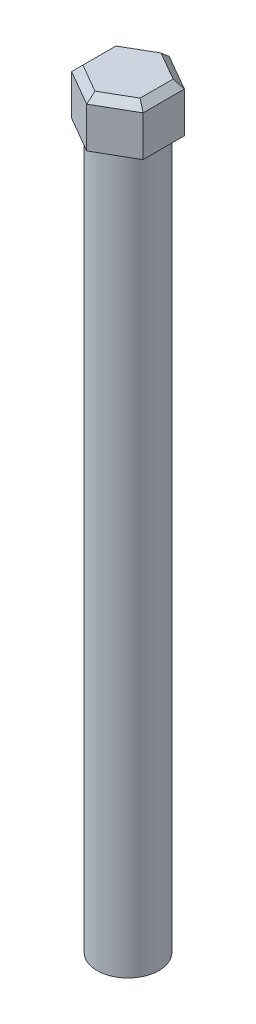
ISO-10303-21;
HEADER;
FILE_DESCRIPTION(('STEP AP214'),'2;1');
FILE_NAME('part.step','',(''),(''),'','','');
FILE_SCHEMA(('AUTOMOTIVE_DESIGN { 1 0 10303 214 1 1 1 1 }'));
ENDSEC;
DATA;
#1=APPLICATION_CONTEXT('core data for automotive mechanical design processes');
#2=APPLICATION_PROTOCOL_DEFINITION('international standard','automotive_design',2000,#1);
#3=PRODUCT_CONTEXT('',#1,'mechanical');
#4=PRODUCT('Part','Part','',(#3));
#5=PRODUCT_RELATED_PRODUCT_CATEGORY('part','',(#4));
#6=PRODUCT_DEFINITION_FORMATION('','',#4);
#7=PRODUCT_DEFINITION_CONTEXT('part definition',#1,'design');
#8=PRODUCT_DEFINITION('design','',#6,#7);
#9=PRODUCT_DEFINITION_SHAPE('','',#8);
#10=(LENGTH_UNIT() NAMED_UNIT(*) SI_UNIT(.MILLI.,.METRE.));
#11=(NAMED_UNIT(*) PLANE_ANGLE_UNIT() SI_UNIT($,.RADIAN.));
#12=(NAMED_UNIT(*) SI_UNIT($,.STERADIAN.) SOLID_ANGLE_UNIT());
#13=UNCERTAINTY_MEASURE_WITH_UNIT(LENGTH_MEASURE(1.E-05),#10,'distance_accuracy_value','');
#14=(GEOMETRIC_REPRESENTATION_CONTEXT(3) GLOBAL_UNCERTAINTY_ASSIGNED_CONTEXT((#13)) GLOBAL_UNIT_ASSIGNED_CONTEXT((#10,
#11,#12)) REPRESENTATION_CONTEXT('',''));
#15=CARTESIAN_POINT('',(0.,0.,0.));
#16=DIRECTION('',(0.,0.,1.));
#17=DIRECTION('',(1.,0.,0.));
#18=AXIS2_PLACEMENT_3D('',#15,#16,#17);
#19=CARTESIAN_POINT('',(0.129999999999999,0.,0.));
#20=DIRECTION('',(0.,-1.,0.));
#21=DIRECTION('',(1.,0.,0.));
#22=AXIS2_PLACEMENT_3D('',#19,#20,#21);
#23=PLANE('',#22);
#24=CARTESIAN_POINT('',(0.,0.,0.));
#25=DIRECTION('',(0.,-1.,0.));
#26=DIRECTION('',(1.,0.,0.));
#27=AXIS2_PLACEMENT_3D('',#24,#25,#26);
#28=CIRCLE('',#27,0.129999999999999);
#29=CARTESIAN_POINT('',(0.129999999999999,0.,0.));
#30=VERTEX_POINT('',#29);
#31=EDGE_CURVE('E175',#30,#30,#28,.T.);
#32=ORIENTED_EDGE('',*,*,#31,.T.);
#33=EDGE_LOOP('',(#32));
#34=FACE_BOUND('',#33,.T.);
#35=ADVANCED_FACE('F41',(#34),#23,.T.);
#36=CARTESIAN_POINT('',(0.,0.,0.));
#37=DIRECTION('',(0.,-1.,0.));
#38=DIRECTION('',(1.,0.,0.));
#39=AXIS2_PLACEMENT_3D('',#36,#37,#38);
#40=CYLINDRICAL_SURFACE('',#39,0.129999999999999);
#41=CARTESIAN_POINT('',(0.,3.,0.));
#42=DIRECTION('',(0.,-1.,0.));
#43=DIRECTION('',(1.,0.,0.));
#44=AXIS2_PLACEMENT_3D('',#41,#42,#43);
#45=CIRCLE('',#44,0.129999999999999);
#46=CARTESIAN_POINT('',(0.129999999999999,3.,0.));
#47=VERTEX_POINT('',#46);
#48=EDGE_CURVE('E126',#47,#47,#45,.T.);
#49=ORIENTED_EDGE('',*,*,#48,.T.);
#50=EDGE_LOOP('',(#49));
#51=FACE_BOUND('',#50,.T.);
#52=ORIENTED_EDGE('',*,*,#31,.F.);
#53=EDGE_LOOP('',(#52));
#54=FACE_BOUND('',#53,.T.);
#55=ADVANCED_FACE('F267',(#51,#54),#40,.T.);
#56=CARTESIAN_POINT('',(0.15,3.2,-0.0866025403784439));
#57=DIRECTION('',(-0.5,0.,0.866025403784438));
#58=DIRECTION('',(0.866025403784439,0.,0.5));
#59=AXIS2_PLACEMENT_3D('',#56,#57,#58);
#60=PLANE('',#59);
#61=DIRECTION('',(0.,-1.,0.));
#62=VECTOR('',#61,1.);
#63=CARTESIAN_POINT('',(0.,3.2,-0.173205080756888));
#64=LINE('',#63,#62);
#65=CARTESIAN_POINT('',(0.,3.17,-0.173205080756888));
#66=VERTEX_POINT('',#65);
#67=CARTESIAN_POINT('',(0.,3.,-0.173205080756888));
#68=VERTEX_POINT('',#67);
#69=EDGE_CURVE('E114',#66,#68,#64,.T.);
#70=ORIENTED_EDGE('',*,*,#69,.F.);
#71=DIRECTION('',(0.866025403784439,0.,0.5));
#72=VECTOR('',#71,1.);
#73=CARTESIAN_POINT('',(0.15,3.17,-0.0866025403784439));
#74=LINE('',#73,#72);
#75=CARTESIAN_POINT('',(0.15,3.17,-0.0866025403784439));
#76=VERTEX_POINT('',#75);
#77=EDGE_CURVE('E205',#66,#76,#74,.T.);
#78=ORIENTED_EDGE('',*,*,#77,.T.);
#79=DIRECTION('',(0.,-1.,0.));
#80=VECTOR('',#79,1.);
#81=CARTESIAN_POINT('',(0.15,3.2,-0.0866025403784439));
#82=LINE('',#81,#80);
#83=CARTESIAN_POINT('',(0.15,3.,-0.0866025403784439));
#84=VERTEX_POINT('',#83);
#85=EDGE_CURVE('E141',#76,#84,#82,.T.);
#86=ORIENTED_EDGE('',*,*,#85,.T.);
#87=DIRECTION('',(-0.866025403784438,0.,-0.5));
#88=VECTOR('',#87,1.);
#89=CARTESIAN_POINT('',(0.15,3.,-0.0866025403784439));
#90=LINE('',#89,#88);
#91=EDGE_CURVE('E133',#84,#68,#90,.T.);
#92=ORIENTED_EDGE('',*,*,#91,.T.);
#93=EDGE_LOOP('',(#70,#78,#86,#92));
#94=FACE_BOUND('',#93,.T.);
#95=ADVANCED_FACE('F139',(#94),#60,.F.);
#96=CARTESIAN_POINT('',(0.,3.2,-0.173205080756888));
#97=DIRECTION('',(0.5,0.,0.866025403784439));
#98=DIRECTION('',(0.866025403784439,0.,-0.5));
#99=AXIS2_PLACEMENT_3D('',#96,#97,#98);
#100=PLANE('',#99);
#101=DIRECTION('',(0.,-1.,0.));
#102=VECTOR('',#101,1.);
#103=CARTESIAN_POINT('',(-0.15,3.2,-0.0866025403784439));
#104=LINE('',#103,#102);
#105=CARTESIAN_POINT('',(-0.15,3.17,-0.0866025403784439));
#106=VERTEX_POINT('',#105);
#107=CARTESIAN_POINT('',(-0.15,3.,-0.0866025403784439));
#108=VERTEX_POINT('',#107);
#109=EDGE_CURVE('E127',#106,#108,#104,.T.);
#110=ORIENTED_EDGE('',*,*,#109,.F.);
#111=DIRECTION('',(0.866025403784439,0.,-0.5));
#112=VECTOR('',#111,1.);
#113=CARTESIAN_POINT('',(0.,3.17,-0.173205080756888));
#114=LINE('',#113,#112);
#115=EDGE_CURVE('E121',#106,#66,#114,.T.);
#116=ORIENTED_EDGE('',*,*,#115,.T.);
#117=ORIENTED_EDGE('',*,*,#69,.T.);
#118=DIRECTION('',(-0.866025403784439,0.,0.5));
#119=VECTOR('',#118,1.);
#120=CARTESIAN_POINT('',(0.,3.,-0.173205080756888));
#121=LINE('',#120,#119);
#122=EDGE_CURVE('E118',#68,#108,#121,.T.);
#123=ORIENTED_EDGE('',*,*,#122,.T.);
#124=EDGE_LOOP('',(#110,#116,#117,#123));
#125=FACE_BOUND('',#124,.T.);
#126=ADVANCED_FACE('F117',(#125),#100,.F.);
#127=CARTESIAN_POINT('',(-0.15,3.2,-0.0866025403784439));
#128=DIRECTION('',(1.,0.,0.));
#129=DIRECTION('',(0.,1.,0.));
#130=AXIS2_PLACEMENT_3D('',#127,#128,#129);
#131=PLANE('',#130);
#132=DIRECTION('',(0.,-1.,0.));
#133=VECTOR('',#132,1.);
#134=CARTESIAN_POINT('',(-0.15,3.2,0.0866025403784439));
#135=LINE('',#134,#133);
#136=CARTESIAN_POINT('',(-0.15,3.17,0.0866025403784439));
#137=VERTEX_POINT('',#136);
#138=CARTESIAN_POINT('',(-0.15,3.,0.0866025403784439));
#139=VERTEX_POINT('',#138);
#140=EDGE_CURVE('E170',#137,#139,#135,.T.);
#141=ORIENTED_EDGE('',*,*,#140,.F.);
#142=DIRECTION('',(0.,0.,-1.));
#143=VECTOR('',#142,1.);
#144=CARTESIAN_POINT('',(-0.15,3.17,-0.0866025403784439));
#145=LINE('',#144,#143);
#146=EDGE_CURVE('E210',#137,#106,#145,.T.);
#147=ORIENTED_EDGE('',*,*,#146,.T.);
#148=ORIENTED_EDGE('',*,*,#109,.T.);
#149=DIRECTION('',(0.,0.,1.));
#150=VECTOR('',#149,1.);
#151=CARTESIAN_POINT('',(-0.15,3.,-0.0866025403784439));
#152=LINE('',#151,#150);
#153=EDGE_CURVE('E136',#108,#139,#152,.T.);
#154=ORIENTED_EDGE('',*,*,#153,.T.);
#155=EDGE_LOOP('',(#141,#147,#148,#154));
#156=FACE_BOUND('',#155,.T.);
#157=ADVANCED_FACE('F370',(#156),#131,.F.);
#158=CARTESIAN_POINT('',(-0.15,3.2,0.0866025403784439));
#159=DIRECTION('',(0.5,0.,-0.866025403784439));
#160=DIRECTION('',(-0.866025403784439,0.,-0.5));
#161=AXIS2_PLACEMENT_3D('',#158,#159,#160);
#162=PLANE('',#161);
#163=DIRECTION('',(0.,-1.,0.));
#164=VECTOR('',#163,1.);
#165=CARTESIAN_POINT('',(0.,3.2,0.173205080756888));
#166=LINE('',#165,#164);
#167=CARTESIAN_POINT('',(0.,3.17,0.173205080756888));
#168=VERTEX_POINT('',#167);
#169=CARTESIAN_POINT('',(0.,3.,0.173205080756888));
#170=VERTEX_POINT('',#169);
#171=EDGE_CURVE('E167',#168,#170,#166,.T.);
#172=ORIENTED_EDGE('',*,*,#171,.F.);
#173=DIRECTION('',(-0.866025403784439,0.,-0.5));
#174=VECTOR('',#173,1.);
#175=CARTESIAN_POINT('',(-0.15,3.17,0.0866025403784439));
#176=LINE('',#175,#174);
#177=EDGE_CURVE('E52',#168,#137,#176,.T.);
#178=ORIENTED_EDGE('',*,*,#177,.T.);
#179=ORIENTED_EDGE('',*,*,#140,.T.);
#180=DIRECTION('',(0.866025403784439,0.,0.5));
#181=VECTOR('',#180,1.);
#182=CARTESIAN_POINT('',(-0.15,3.,0.0866025403784439));
#183=LINE('',#182,#181);
#184=EDGE_CURVE('E151',#139,#170,#183,.T.);
#185=ORIENTED_EDGE('',*,*,#184,.T.);
#186=EDGE_LOOP('',(#172,#178,#179,#185));
#187=FACE_BOUND('',#186,.T.);
#188=ADVANCED_FACE('F362',(#187),#162,.F.);
#189=CARTESIAN_POINT('',(0.,3.2,0.173205080756888));
#190=DIRECTION('',(-0.5,0.,-0.866025403784439));
#191=DIRECTION('',(-0.866025403784439,0.,0.5));
#192=AXIS2_PLACEMENT_3D('',#189,#190,#191);
#193=PLANE('',#192);
#194=DIRECTION('',(0.,-1.,0.));
#195=VECTOR('',#194,1.);
#196=CARTESIAN_POINT('',(0.15,3.2,0.086602540378444));
#197=LINE('',#196,#195);
#198=CARTESIAN_POINT('',(0.15,3.17,0.086602540378444));
#199=VERTEX_POINT('',#198);
#200=CARTESIAN_POINT('',(0.15,3.,0.086602540378444));
#201=VERTEX_POINT('',#200);
#202=EDGE_CURVE('E164',#199,#201,#197,.T.);
#203=ORIENTED_EDGE('',*,*,#202,.F.);
#204=DIRECTION('',(-0.866025403784439,0.,0.5));
#205=VECTOR('',#204,1.);
#206=CARTESIAN_POINT('',(0.,3.17,0.173205080756888));
#207=LINE('',#206,#205);
#208=EDGE_CURVE('E11',#199,#168,#207,.T.);
#209=ORIENTED_EDGE('',*,*,#208,.T.);
#210=ORIENTED_EDGE('',*,*,#171,.T.);
#211=DIRECTION('',(0.866025403784439,0.,-0.5));
#212=VECTOR('',#211,1.);
#213=CARTESIAN_POINT('',(0.,3.,0.173205080756888));
#214=LINE('',#213,#212);
#215=EDGE_CURVE('E155',#170,#201,#214,.T.);
#216=ORIENTED_EDGE('',*,*,#215,.T.);
#217=EDGE_LOOP('',(#203,#209,#210,#216));
#218=FACE_BOUND('',#217,.T.);
#219=ADVANCED_FACE('F354',(#218),#193,.F.);
#220=CARTESIAN_POINT('',(0.15,3.2,0.086602540378444));
#221=DIRECTION('',(-1.,0.,0.));
#222=DIRECTION('',(0.,0.,1.));
#223=AXIS2_PLACEMENT_3D('',#220,#221,#222);
#224=PLANE('',#223);
#225=ORIENTED_EDGE('',*,*,#85,.F.);
#226=DIRECTION('',(0.,0.,1.));
#227=VECTOR('',#226,1.);
#228=CARTESIAN_POINT('',(0.15,3.17,0.086602540378444));
#229=LINE('',#228,#227);
#230=EDGE_CURVE('E201',#76,#199,#229,.T.);
#231=ORIENTED_EDGE('',*,*,#230,.T.);
#232=ORIENTED_EDGE('',*,*,#202,.T.);
#233=DIRECTION('',(0.,0.,-1.));
#234=VECTOR('',#233,1.);
#235=CARTESIAN_POINT('',(0.15,3.,0.086602540378444));
#236=LINE('',#235,#234);
#237=EDGE_CURVE('E159',#201,#84,#236,.T.);
#238=ORIENTED_EDGE('',*,*,#237,.T.);
#239=EDGE_LOOP('',(#225,#231,#232,#238));
#240=FACE_BOUND('',#239,.T.);
#241=ADVANCED_FACE('F250',(#240),#224,.F.);
#242=CARTESIAN_POINT('',(0.,3.2,0.));
#243=DIRECTION('',(0.,1.,0.));
#244=DIRECTION('',(0.,0.,1.));
#245=AXIS2_PLACEMENT_3D('',#242,#243,#244);
#246=PLANE('',#245);
#247=DIRECTION('',(0.866025403784439,0.,-0.5));
#248=VECTOR('',#247,1.);
#249=CARTESIAN_POINT('',(0.135,3.2,0.0606217782649107));
#250=LINE('',#249,#248);
#251=CARTESIAN_POINT('',(0.,3.2,0.13856406460551));
#252=VERTEX_POINT('',#251);
#253=CARTESIAN_POINT('',(0.12,3.2,0.0692820323027551));
#254=VERTEX_POINT('',#253);
#255=EDGE_CURVE('E179',#252,#254,#250,.T.);
#256=ORIENTED_EDGE('',*,*,#255,.T.);
#257=DIRECTION('',(0.,0.,-1.));
#258=VECTOR('',#257,1.);
#259=CARTESIAN_POINT('',(0.12,3.2,-0.0866025403784439));
#260=LINE('',#259,#258);
#261=CARTESIAN_POINT('',(0.12,3.2,-0.0692820323027551));
#262=VERTEX_POINT('',#261);
#263=EDGE_CURVE('E197',#254,#262,#260,.T.);
#264=ORIENTED_EDGE('',*,*,#263,.T.);
#265=DIRECTION('',(-0.866025403784439,0.,-0.5));
#266=VECTOR('',#265,1.);
#267=CARTESIAN_POINT('',(-0.0149999999999999,3.2,-0.147224318643355));
#268=LINE('',#267,#266);
#269=CARTESIAN_POINT('',(0.,3.2,-0.13856406460551));
#270=VERTEX_POINT('',#269);
#271=EDGE_CURVE('E194',#262,#270,#268,.T.);
#272=ORIENTED_EDGE('',*,*,#271,.T.);
#273=DIRECTION('',(-0.866025403784439,0.,0.5));
#274=VECTOR('',#273,1.);
#275=CARTESIAN_POINT('',(-0.135,3.2,-0.0606217782649107));
#276=LINE('',#275,#274);
#277=CARTESIAN_POINT('',(-0.12,3.2,-0.0692820323027551));
#278=VERTEX_POINT('',#277);
#279=EDGE_CURVE('E191',#270,#278,#276,.T.);
#280=ORIENTED_EDGE('',*,*,#279,.T.);
#281=DIRECTION('',(0.,0.,1.));
#282=VECTOR('',#281,1.);
#283=CARTESIAN_POINT('',(-0.12,3.2,0.0866025403784439));
#284=LINE('',#283,#282);
#285=CARTESIAN_POINT('',(-0.12,3.2,0.069282032302755));
#286=VERTEX_POINT('',#285);
#287=EDGE_CURVE('E188',#278,#286,#284,.T.);
#288=ORIENTED_EDGE('',*,*,#287,.T.);
#289=DIRECTION('',(0.866025403784439,0.,0.5));
#290=VECTOR('',#289,1.);
#291=CARTESIAN_POINT('',(0.0150000000000001,3.2,0.147224318643354));
#292=LINE('',#291,#290);
#293=EDGE_CURVE('E185',#286,#252,#292,.T.);
#294=ORIENTED_EDGE('',*,*,#293,.T.);
#295=EDGE_LOOP('',(#256,#264,#272,#280,#288,#294));
#296=FACE_BOUND('',#295,.T.);
#297=ADVANCED_FACE('F240',(#296),#246,.T.);
#298=CARTESIAN_POINT('',(0.,3.,0.));
#299=DIRECTION('',(0.,1.,0.));
#300=DIRECTION('',(0.,0.,1.));
#301=AXIS2_PLACEMENT_3D('',#298,#299,#300);
#302=PLANE('',#301);
#303=ORIENTED_EDGE('',*,*,#48,.F.);
#304=EDGE_LOOP('',(#303));
#305=FACE_BOUND('',#304,.T.);
#306=ORIENTED_EDGE('',*,*,#91,.F.);
#307=ORIENTED_EDGE('',*,*,#237,.F.);
#308=ORIENTED_EDGE('',*,*,#215,.F.);
#309=ORIENTED_EDGE('',*,*,#184,.F.);
#310=ORIENTED_EDGE('',*,*,#153,.F.);
#311=ORIENTED_EDGE('',*,*,#122,.F.);
#312=EDGE_LOOP('',(#306,#307,#308,#309,#310,#311));
#313=FACE_BOUND('',#312,.T.);
#314=ADVANCED_FACE('F131',(#305,#313),#302,.F.);
#315=CARTESIAN_POINT('',(-0.12,3.2,0.));
#316=DIRECTION('',(-0.707106781186547,0.707106781186548,0.));
#317=DIRECTION('',(0.,0.,-1.));
#318=AXIS2_PLACEMENT_3D('',#315,#316,#317);
#319=PLANE('',#318);
#320=DIRECTION('',(-0.654653670707978,-0.654653670707977,-0.377964473009228));
#321=VECTOR('',#320,1.);
#322=CARTESIAN_POINT('',(-0.102857142857143,3.21714285714286,-0.0593845991166472));
#323=LINE('',#322,#321);
#324=EDGE_CURVE('E147',#106,#278,#323,.F.);
#325=ORIENTED_EDGE('',*,*,#324,.F.);
#326=ORIENTED_EDGE('',*,*,#146,.F.);
#327=DIRECTION('',(-0.654653670707978,-0.654653670707977,0.377964473009227));
#328=VECTOR('',#327,1.);
#329=CARTESIAN_POINT('',(-0.102857142857143,3.21714285714286,0.0593845991166472));
#330=LINE('',#329,#328);
#331=EDGE_CURVE('E46',#286,#137,#330,.T.);
#332=ORIENTED_EDGE('',*,*,#331,.F.);
#333=ORIENTED_EDGE('',*,*,#287,.F.);
#334=EDGE_LOOP('',(#325,#326,#332,#333));
#335=FACE_BOUND('',#334,.T.);
#336=ADVANCED_FACE('F44',(#335),#319,.T.);
#337=CARTESIAN_POINT('',(-0.0599999999999999,3.2,0.103923048454132));
#338=DIRECTION('',(-0.353553390593274,0.707106781186548,0.612372435695794));
#339=DIRECTION('',(-0.866025403784439,0.,-0.5));
#340=AXIS2_PLACEMENT_3D('',#337,#338,#339);
#341=PLANE('',#340);
#342=ORIENTED_EDGE('',*,*,#331,.T.);
#343=ORIENTED_EDGE('',*,*,#177,.F.);
#344=DIRECTION('',(0.,-0.654653670707977,0.755928946018455));
#345=VECTOR('',#344,1.);
#346=CARTESIAN_POINT('',(0.,3.21714285714286,0.118769198233294));
#347=LINE('',#346,#345);
#348=EDGE_CURVE('E225',#252,#168,#347,.T.);
#349=ORIENTED_EDGE('',*,*,#348,.F.);
#350=ORIENTED_EDGE('',*,*,#293,.F.);
#351=EDGE_LOOP('',(#342,#343,#349,#350));
#352=FACE_BOUND('',#351,.T.);
#353=ADVANCED_FACE('F258',(#352),#341,.T.);
#354=CARTESIAN_POINT('',(-0.0599999999999999,3.2,-0.103923048454133));
#355=DIRECTION('',(-0.353553390593273,0.707106781186548,-0.612372435695794));
#356=DIRECTION('',(0.866025403784439,0.,-0.5));
#357=AXIS2_PLACEMENT_3D('',#354,#355,#356);
#358=PLANE('',#357);
#359=ORIENTED_EDGE('',*,*,#324,.T.);
#360=ORIENTED_EDGE('',*,*,#279,.F.);
#361=DIRECTION('',(0.,-0.654653670707977,-0.755928946018455));
#362=VECTOR('',#361,1.);
#363=CARTESIAN_POINT('',(0.,3.21714285714286,-0.118769198233294));
#364=LINE('',#363,#362);
#365=EDGE_CURVE('E221',#66,#270,#364,.F.);
#366=ORIENTED_EDGE('',*,*,#365,.F.);
#367=ORIENTED_EDGE('',*,*,#115,.F.);
#368=EDGE_LOOP('',(#359,#360,#366,#367));
#369=FACE_BOUND('',#368,.T.);
#370=ADVANCED_FACE('F233',(#369),#358,.T.);
#371=CARTESIAN_POINT('',(0.06,3.2,0.103923048454133));
#372=DIRECTION('',(0.353553390593273,0.707106781186548,0.612372435695794));
#373=DIRECTION('',(-0.866025403784439,0.,0.5));
#374=AXIS2_PLACEMENT_3D('',#371,#372,#373);
#375=PLANE('',#374);
#376=ORIENTED_EDGE('',*,*,#348,.T.);
#377=ORIENTED_EDGE('',*,*,#208,.F.);
#378=DIRECTION('',(-0.654653670707978,0.654653670707977,-0.377964473009228));
#379=VECTOR('',#378,1.);
#380=CARTESIAN_POINT('',(0.102857142857143,3.21714285714286,0.0593845991166472));
#381=LINE('',#380,#379);
#382=EDGE_CURVE('E218',#254,#199,#381,.F.);
#383=ORIENTED_EDGE('',*,*,#382,.F.);
#384=ORIENTED_EDGE('',*,*,#255,.F.);
#385=EDGE_LOOP('',(#376,#377,#383,#384));
#386=FACE_BOUND('',#385,.T.);
#387=ADVANCED_FACE('F256',(#386),#375,.T.);
#388=CARTESIAN_POINT('',(0.06,3.2,-0.103923048454133));
#389=DIRECTION('',(0.353553390593274,0.707106781186548,-0.612372435695794));
#390=DIRECTION('',(0.866025403784439,0.,0.5));
#391=AXIS2_PLACEMENT_3D('',#388,#389,#390);
#392=PLANE('',#391);
#393=ORIENTED_EDGE('',*,*,#365,.T.);
#394=ORIENTED_EDGE('',*,*,#271,.F.);
#395=DIRECTION('',(0.654653670707978,-0.654653670707977,-0.377964473009227));
#396=VECTOR('',#395,1.);
#397=CARTESIAN_POINT('',(0.102857142857143,3.21714285714286,-0.0593845991166473));
#398=LINE('',#397,#396);
#399=EDGE_CURVE('E215',#76,#262,#398,.F.);
#400=ORIENTED_EDGE('',*,*,#399,.F.);
#401=ORIENTED_EDGE('',*,*,#77,.F.);
#402=EDGE_LOOP('',(#393,#394,#400,#401));
#403=FACE_BOUND('',#402,.T.);
#404=ADVANCED_FACE('F246',(#403),#392,.T.);
#405=CARTESIAN_POINT('',(0.12,3.2,0.));
#406=DIRECTION('',(0.707106781186547,0.707106781186548,0.));
#407=DIRECTION('',(0.,0.,1.));
#408=AXIS2_PLACEMENT_3D('',#405,#406,#407);
#409=PLANE('',#408);
#410=ORIENTED_EDGE('',*,*,#382,.T.);
#411=ORIENTED_EDGE('',*,*,#230,.F.);
#412=ORIENTED_EDGE('',*,*,#399,.T.);
#413=ORIENTED_EDGE('',*,*,#263,.F.);
#414=EDGE_LOOP('',(#410,#411,#412,#413));
#415=FACE_BOUND('',#414,.T.);
#416=ADVANCED_FACE('F252',(#415),#409,.T.);
#417=CLOSED_SHELL('',(#35,#55,#95,#126,#157,#188,#219,#241,#297,#314,#336,#353,#370,#387,#404,#416));
#418=MANIFOLD_SOLID_BREP('B2',#417);
#419=ADVANCED_BREP_SHAPE_REPRESENTATION('',(#18,#418),#14);
#420=SHAPE_DEFINITION_REPRESENTATION(#9,#419);
ENDSEC;
END-ISO-10303-21;
